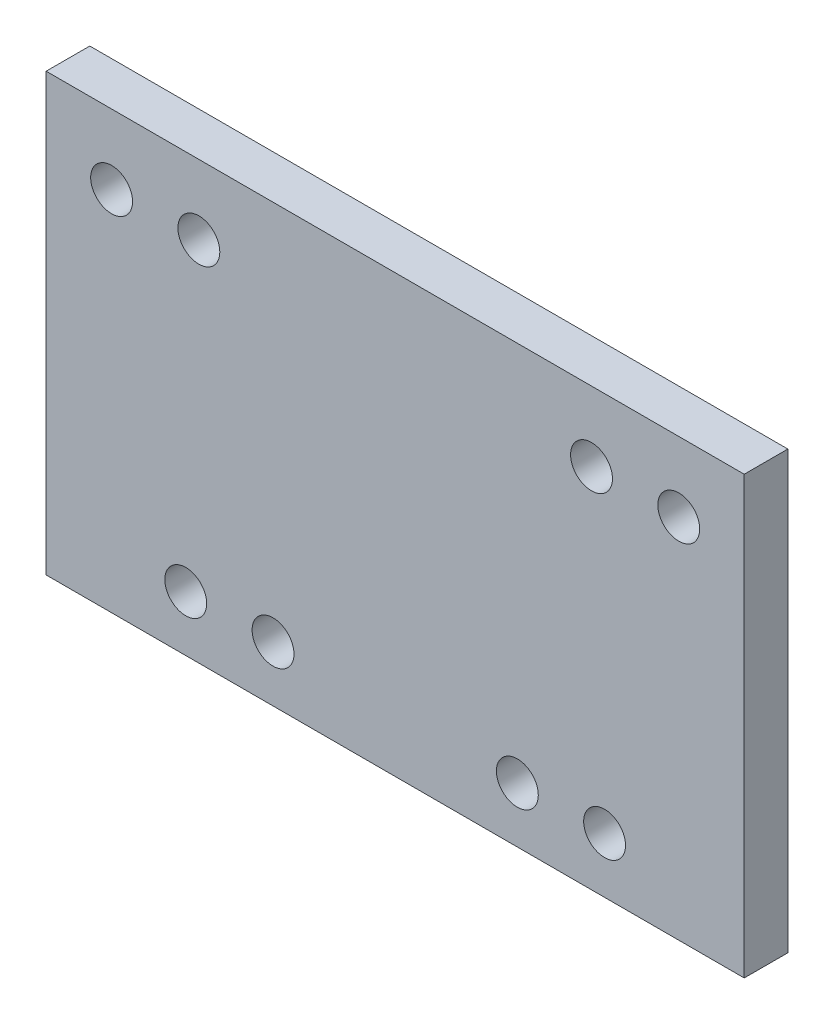
ISO-10303-21;
HEADER;
FILE_DESCRIPTION(('STEP AP214'),'2;1');
FILE_NAME('part.step','',(''),(''),'','','');
FILE_SCHEMA(('AUTOMOTIVE_DESIGN { 1 0 10303 214 1 1 1 1 }'));
ENDSEC;
DATA;
#1=APPLICATION_CONTEXT('core data for automotive mechanical design processes');
#2=APPLICATION_PROTOCOL_DEFINITION('international standard','automotive_design',2000,#1);
#3=PRODUCT_CONTEXT('',#1,'mechanical');
#4=PRODUCT('Part','Part','',(#3));
#5=PRODUCT_RELATED_PRODUCT_CATEGORY('part','',(#4));
#6=PRODUCT_DEFINITION_FORMATION('','',#4);
#7=PRODUCT_DEFINITION_CONTEXT('part definition',#1,'design');
#8=PRODUCT_DEFINITION('design','',#6,#7);
#9=PRODUCT_DEFINITION_SHAPE('','',#8);
#10=(LENGTH_UNIT() NAMED_UNIT(*) SI_UNIT(.MILLI.,.METRE.));
#11=(NAMED_UNIT(*) PLANE_ANGLE_UNIT() SI_UNIT($,.RADIAN.));
#12=(NAMED_UNIT(*) SI_UNIT($,.STERADIAN.) SOLID_ANGLE_UNIT());
#13=UNCERTAINTY_MEASURE_WITH_UNIT(LENGTH_MEASURE(1.E-05),#10,'distance_accuracy_value','');
#14=(GEOMETRIC_REPRESENTATION_CONTEXT(3) GLOBAL_UNCERTAINTY_ASSIGNED_CONTEXT((#13)) GLOBAL_UNIT_ASSIGNED_CONTEXT((#10,
#11,#12)) REPRESENTATION_CONTEXT('',''));
#15=CARTESIAN_POINT('',(0.,0.,0.));
#16=DIRECTION('',(0.,0.,1.));
#17=DIRECTION('',(1.,0.,0.));
#18=AXIS2_PLACEMENT_3D('',#15,#16,#17);
#19=CARTESIAN_POINT('',(39.9999999999999,24.9999999999999,5.));
#20=DIRECTION('',(-1.,0.,0.));
#21=DIRECTION('',(0.,0.,1.));
#22=AXIS2_PLACEMENT_3D('',#19,#20,#21);
#23=PLANE('',#22);
#24=DIRECTION('',(0.,1.,0.));
#25=VECTOR('',#24,1.);
#26=CARTESIAN_POINT('',(39.9999999999999,24.9999999999999,0.));
#27=LINE('',#26,#25);
#28=CARTESIAN_POINT('',(39.9999999999999,-25.0000000000001,0.));
#29=VERTEX_POINT('',#28);
#30=CARTESIAN_POINT('',(39.9999999999999,24.9999999999999,0.));
#31=VERTEX_POINT('',#30);
#32=EDGE_CURVE('E100',#29,#31,#27,.T.);
#33=ORIENTED_EDGE('',*,*,#32,.T.);
#34=DIRECTION('',(0.,0.,-1.));
#35=VECTOR('',#34,1.);
#36=CARTESIAN_POINT('',(39.9999999999999,24.9999999999999,5.));
#37=LINE('',#36,#35);
#38=CARTESIAN_POINT('',(39.9999999999999,24.9999999999999,5.));
#39=VERTEX_POINT('',#38);
#40=EDGE_CURVE('E11',#39,#31,#37,.T.);
#41=ORIENTED_EDGE('',*,*,#40,.F.);
#42=DIRECTION('',(0.,1.,0.));
#43=VECTOR('',#42,1.);
#44=CARTESIAN_POINT('',(39.9999999999999,24.9999999999999,5.));
#45=LINE('',#44,#43);
#46=CARTESIAN_POINT('',(39.9999999999999,-25.0000000000001,5.));
#47=VERTEX_POINT('',#46);
#48=EDGE_CURVE('E88',#47,#39,#45,.T.);
#49=ORIENTED_EDGE('',*,*,#48,.F.);
#50=DIRECTION('',(0.,0.,-1.));
#51=VECTOR('',#50,1.);
#52=CARTESIAN_POINT('',(39.9999999999999,-25.0000000000001,5.));
#53=LINE('',#52,#51);
#54=EDGE_CURVE('E96',#47,#29,#53,.T.);
#55=ORIENTED_EDGE('',*,*,#54,.T.);
#56=EDGE_LOOP('',(#33,#41,#49,#55));
#57=FACE_BOUND('',#56,.T.);
#58=ADVANCED_FACE('F37',(#57),#23,.F.);
#59=CARTESIAN_POINT('',(-39.9999999999999,24.9999999999999,5.));
#60=DIRECTION('',(0.,-1.,0.));
#61=DIRECTION('',(0.,0.,-1.));
#62=AXIS2_PLACEMENT_3D('',#59,#60,#61);
#63=PLANE('',#62);
#64=DIRECTION('',(-1.,0.,0.));
#65=VECTOR('',#64,1.);
#66=CARTESIAN_POINT('',(-39.9999999999999,24.9999999999999,0.));
#67=LINE('',#66,#65);
#68=CARTESIAN_POINT('',(-39.9999999999999,24.9999999999999,0.));
#69=VERTEX_POINT('',#68);
#70=EDGE_CURVE('E92',#31,#69,#67,.T.);
#71=ORIENTED_EDGE('',*,*,#70,.T.);
#72=DIRECTION('',(0.,0.,-1.));
#73=VECTOR('',#72,1.);
#74=CARTESIAN_POINT('',(-39.9999999999999,24.9999999999999,5.));
#75=LINE('',#74,#73);
#76=CARTESIAN_POINT('',(-39.9999999999999,24.9999999999999,5.));
#77=VERTEX_POINT('',#76);
#78=EDGE_CURVE('E45',#77,#69,#75,.T.);
#79=ORIENTED_EDGE('',*,*,#78,.F.);
#80=DIRECTION('',(-1.,0.,0.));
#81=VECTOR('',#80,1.);
#82=CARTESIAN_POINT('',(-39.9999999999999,24.9999999999999,5.));
#83=LINE('',#82,#81);
#84=EDGE_CURVE('E83',#39,#77,#83,.T.);
#85=ORIENTED_EDGE('',*,*,#84,.F.);
#86=ORIENTED_EDGE('',*,*,#40,.T.);
#87=EDGE_LOOP('',(#71,#79,#85,#86));
#88=FACE_BOUND('',#87,.T.);
#89=ADVANCED_FACE('F91',(#88),#63,.F.);
#90=CARTESIAN_POINT('',(-39.9999999999999,24.9999999999999,5.));
#91=DIRECTION('',(1.,0.,0.));
#92=DIRECTION('',(0.,0.,-1.));
#93=AXIS2_PLACEMENT_3D('',#90,#91,#92);
#94=PLANE('',#93);
#95=DIRECTION('',(0.,-1.,0.));
#96=VECTOR('',#95,1.);
#97=CARTESIAN_POINT('',(-39.9999999999999,24.9999999999999,0.));
#98=LINE('',#97,#96);
#99=CARTESIAN_POINT('',(-39.9999999999999,-25.0000000000001,0.));
#100=VERTEX_POINT('',#99);
#101=EDGE_CURVE('E70',#69,#100,#98,.T.);
#102=ORIENTED_EDGE('',*,*,#101,.T.);
#103=DIRECTION('',(0.,0.,-1.));
#104=VECTOR('',#103,1.);
#105=CARTESIAN_POINT('',(-39.9999999999999,-25.0000000000001,5.));
#106=LINE('',#105,#104);
#107=CARTESIAN_POINT('',(-39.9999999999999,-25.0000000000001,5.));
#108=VERTEX_POINT('',#107);
#109=EDGE_CURVE('E93',#108,#100,#106,.T.);
#110=ORIENTED_EDGE('',*,*,#109,.F.);
#111=DIRECTION('',(0.,-1.,0.));
#112=VECTOR('',#111,1.);
#113=CARTESIAN_POINT('',(-39.9999999999999,24.9999999999999,5.));
#114=LINE('',#113,#112);
#115=EDGE_CURVE('E86',#77,#108,#114,.T.);
#116=ORIENTED_EDGE('',*,*,#115,.F.);
#117=ORIENTED_EDGE('',*,*,#78,.T.);
#118=EDGE_LOOP('',(#102,#110,#116,#117));
#119=FACE_BOUND('',#118,.T.);
#120=ADVANCED_FACE('F94',(#119),#94,.F.);
#121=CARTESIAN_POINT('',(-39.9999999999999,-25.0000000000001,5.));
#122=DIRECTION('',(0.,1.,0.));
#123=DIRECTION('',(0.,0.,1.));
#124=AXIS2_PLACEMENT_3D('',#121,#122,#123);
#125=PLANE('',#124);
#126=DIRECTION('',(1.,0.,0.));
#127=VECTOR('',#126,1.);
#128=CARTESIAN_POINT('',(-39.9999999999999,-25.0000000000001,0.));
#129=LINE('',#128,#127);
#130=EDGE_CURVE('E76',#100,#29,#129,.T.);
#131=ORIENTED_EDGE('',*,*,#130,.T.);
#132=ORIENTED_EDGE('',*,*,#54,.F.);
#133=DIRECTION('',(1.,0.,0.));
#134=VECTOR('',#133,1.);
#135=CARTESIAN_POINT('',(-39.9999999999999,-25.0000000000001,5.));
#136=LINE('',#135,#134);
#137=EDGE_CURVE('E53',#108,#47,#136,.T.);
#138=ORIENTED_EDGE('',*,*,#137,.F.);
#139=ORIENTED_EDGE('',*,*,#109,.T.);
#140=EDGE_LOOP('',(#131,#132,#138,#139));
#141=FACE_BOUND('',#140,.T.);
#142=ADVANCED_FACE('F108',(#141),#125,.F.);
#143=CARTESIAN_POINT('',(0.,0.,5.));
#144=DIRECTION('',(0.,0.,1.));
#145=DIRECTION('',(1.,0.,0.));
#146=AXIS2_PLACEMENT_3D('',#143,#144,#145);
#147=PLANE('',#146);
#148=CARTESIAN_POINT('',(-32.4999999999999,17.0000000999999,5.));
#149=DIRECTION('',(0.,0.,1.));
#150=DIRECTION('',(1.,0.,0.));
#151=AXIS2_PLACEMENT_3D('',#148,#149,#150);
#152=CIRCLE('',#151,2.39999999999999);
#153=CARTESIAN_POINT('',(-30.1,17.0000000999999,5.));
#154=VERTEX_POINT('',#153);
#155=EDGE_CURVE('E158',#154,#154,#152,.T.);
#156=ORIENTED_EDGE('',*,*,#155,.F.);
#157=EDGE_LOOP('',(#156));
#158=FACE_BOUND('',#157,.T.);
#159=CARTESIAN_POINT('',(-22.4999999999999,17.0000001,5.));
#160=DIRECTION('',(0.,0.,1.));
#161=DIRECTION('',(1.,0.,0.));
#162=AXIS2_PLACEMENT_3D('',#159,#160,#161);
#163=CIRCLE('',#162,2.39999999999999);
#164=CARTESIAN_POINT('',(-20.1,17.0000001,5.));
#165=VERTEX_POINT('',#164);
#166=EDGE_CURVE('E152',#165,#165,#163,.T.);
#167=ORIENTED_EDGE('',*,*,#166,.F.);
#168=EDGE_LOOP('',(#167));
#169=FACE_BOUND('',#168,.T.);
#170=CARTESIAN_POINT('',(-23.9999999999996,-18.6499999999999,5.));
#171=DIRECTION('',(0.,0.,1.));
#172=DIRECTION('',(1.,0.,0.));
#173=AXIS2_PLACEMENT_3D('',#170,#171,#172);
#174=CIRCLE('',#173,2.39999999999999);
#175=CARTESIAN_POINT('',(-21.5999999999996,-18.6499999999999,5.));
#176=VERTEX_POINT('',#175);
#177=EDGE_CURVE('E146',#176,#176,#174,.T.);
#178=ORIENTED_EDGE('',*,*,#177,.F.);
#179=EDGE_LOOP('',(#178));
#180=FACE_BOUND('',#179,.T.);
#181=CARTESIAN_POINT('',(-13.9999999999996,-18.6499999999999,5.));
#182=DIRECTION('',(0.,0.,1.));
#183=DIRECTION('',(1.,0.,0.));
#184=AXIS2_PLACEMENT_3D('',#181,#182,#183);
#185=CIRCLE('',#184,2.39999999999999);
#186=CARTESIAN_POINT('',(-11.5999999999996,-18.6499999999999,5.));
#187=VERTEX_POINT('',#186);
#188=EDGE_CURVE('E140',#187,#187,#185,.T.);
#189=ORIENTED_EDGE('',*,*,#188,.F.);
#190=EDGE_LOOP('',(#189));
#191=FACE_BOUND('',#190,.T.);
#192=CARTESIAN_POINT('',(13.9999999999996,-18.6499999999999,5.));
#193=DIRECTION('',(0.,0.,1.));
#194=DIRECTION('',(1.,0.,0.));
#195=AXIS2_PLACEMENT_3D('',#192,#193,#194);
#196=CIRCLE('',#195,2.39999999999999);
#197=CARTESIAN_POINT('',(16.3999999999996,-18.6499999999999,5.));
#198=VERTEX_POINT('',#197);
#199=EDGE_CURVE('E134',#198,#198,#196,.T.);
#200=ORIENTED_EDGE('',*,*,#199,.F.);
#201=EDGE_LOOP('',(#200));
#202=FACE_BOUND('',#201,.T.);
#203=CARTESIAN_POINT('',(23.9999999999996,-18.6499999999999,5.));
#204=DIRECTION('',(0.,0.,1.));
#205=DIRECTION('',(1.,0.,0.));
#206=AXIS2_PLACEMENT_3D('',#203,#204,#205);
#207=CIRCLE('',#206,2.39999999999999);
#208=CARTESIAN_POINT('',(26.3999999999996,-18.6499999999999,5.));
#209=VERTEX_POINT('',#208);
#210=EDGE_CURVE('E128',#209,#209,#207,.T.);
#211=ORIENTED_EDGE('',*,*,#210,.F.);
#212=EDGE_LOOP('',(#211));
#213=FACE_BOUND('',#212,.T.);
#214=CARTESIAN_POINT('',(22.4999999999999,17.0000001,5.));
#215=DIRECTION('',(0.,0.,1.));
#216=DIRECTION('',(1.,0.,0.));
#217=AXIS2_PLACEMENT_3D('',#214,#215,#216);
#218=CIRCLE('',#217,2.39999999999999);
#219=CARTESIAN_POINT('',(24.8999999999999,17.0000001,5.));
#220=VERTEX_POINT('',#219);
#221=EDGE_CURVE('E122',#220,#220,#218,.T.);
#222=ORIENTED_EDGE('',*,*,#221,.F.);
#223=EDGE_LOOP('',(#222));
#224=FACE_BOUND('',#223,.T.);
#225=CARTESIAN_POINT('',(32.4999999999999,17.0000000999999,5.));
#226=DIRECTION('',(0.,0.,1.));
#227=DIRECTION('',(1.,0.,0.));
#228=AXIS2_PLACEMENT_3D('',#225,#226,#227);
#229=CIRCLE('',#228,2.39999999999999);
#230=CARTESIAN_POINT('',(34.8999999999999,17.0000000999999,5.));
#231=VERTEX_POINT('',#230);
#232=EDGE_CURVE('E116',#231,#231,#229,.T.);
#233=ORIENTED_EDGE('',*,*,#232,.F.);
#234=EDGE_LOOP('',(#233));
#235=FACE_BOUND('',#234,.T.);
#236=ORIENTED_EDGE('',*,*,#48,.T.);
#237=ORIENTED_EDGE('',*,*,#84,.T.);
#238=ORIENTED_EDGE('',*,*,#115,.T.);
#239=ORIENTED_EDGE('',*,*,#137,.T.);
#240=EDGE_LOOP('',(#236,#237,#238,#239));
#241=FACE_BOUND('',#240,.T.);
#242=ADVANCED_FACE('F84',(#158,#169,#180,#191,#202,#213,#224,#235,#241),#147,.T.);
#243=CARTESIAN_POINT('',(0.,0.,0.));
#244=DIRECTION('',(0.,0.,1.));
#245=DIRECTION('',(1.,0.,0.));
#246=AXIS2_PLACEMENT_3D('',#243,#244,#245);
#247=PLANE('',#246);
#248=CARTESIAN_POINT('',(-32.4999999999999,17.0000000999999,0.));
#249=DIRECTION('',(0.,0.,1.));
#250=DIRECTION('',(1.,0.,0.));
#251=AXIS2_PLACEMENT_3D('',#248,#249,#250);
#252=CIRCLE('',#251,2.4);
#253=CARTESIAN_POINT('',(-30.0999999999999,17.0000000999999,0.));
#254=VERTEX_POINT('',#253);
#255=EDGE_CURVE('E155',#254,#254,#252,.T.);
#256=ORIENTED_EDGE('',*,*,#255,.T.);
#257=EDGE_LOOP('',(#256));
#258=FACE_BOUND('',#257,.T.);
#259=CARTESIAN_POINT('',(-22.4999999999999,17.0000001,0.));
#260=DIRECTION('',(0.,0.,1.));
#261=DIRECTION('',(1.,0.,0.));
#262=AXIS2_PLACEMENT_3D('',#259,#260,#261);
#263=CIRCLE('',#262,2.4);
#264=CARTESIAN_POINT('',(-20.0999999999999,17.0000001,0.));
#265=VERTEX_POINT('',#264);
#266=EDGE_CURVE('E149',#265,#265,#263,.T.);
#267=ORIENTED_EDGE('',*,*,#266,.T.);
#268=EDGE_LOOP('',(#267));
#269=FACE_BOUND('',#268,.T.);
#270=CARTESIAN_POINT('',(-23.9999999999996,-18.6499999999999,0.));
#271=DIRECTION('',(0.,0.,1.));
#272=DIRECTION('',(1.,0.,0.));
#273=AXIS2_PLACEMENT_3D('',#270,#271,#272);
#274=CIRCLE('',#273,2.4);
#275=CARTESIAN_POINT('',(-21.5999999999996,-18.6499999999999,0.));
#276=VERTEX_POINT('',#275);
#277=EDGE_CURVE('E143',#276,#276,#274,.T.);
#278=ORIENTED_EDGE('',*,*,#277,.T.);
#279=EDGE_LOOP('',(#278));
#280=FACE_BOUND('',#279,.T.);
#281=CARTESIAN_POINT('',(-13.9999999999996,-18.6499999999999,0.));
#282=DIRECTION('',(0.,0.,1.));
#283=DIRECTION('',(1.,0.,0.));
#284=AXIS2_PLACEMENT_3D('',#281,#282,#283);
#285=CIRCLE('',#284,2.4);
#286=CARTESIAN_POINT('',(-11.5999999999996,-18.6499999999999,0.));
#287=VERTEX_POINT('',#286);
#288=EDGE_CURVE('E137',#287,#287,#285,.T.);
#289=ORIENTED_EDGE('',*,*,#288,.T.);
#290=EDGE_LOOP('',(#289));
#291=FACE_BOUND('',#290,.T.);
#292=CARTESIAN_POINT('',(13.9999999999996,-18.6499999999999,0.));
#293=DIRECTION('',(0.,0.,1.));
#294=DIRECTION('',(1.,0.,0.));
#295=AXIS2_PLACEMENT_3D('',#292,#293,#294);
#296=CIRCLE('',#295,2.4);
#297=CARTESIAN_POINT('',(16.3999999999996,-18.6499999999999,0.));
#298=VERTEX_POINT('',#297);
#299=EDGE_CURVE('E131',#298,#298,#296,.T.);
#300=ORIENTED_EDGE('',*,*,#299,.T.);
#301=EDGE_LOOP('',(#300));
#302=FACE_BOUND('',#301,.T.);
#303=CARTESIAN_POINT('',(23.9999999999996,-18.6499999999999,0.));
#304=DIRECTION('',(0.,0.,1.));
#305=DIRECTION('',(1.,0.,0.));
#306=AXIS2_PLACEMENT_3D('',#303,#304,#305);
#307=CIRCLE('',#306,2.4);
#308=CARTESIAN_POINT('',(26.3999999999996,-18.6499999999999,0.));
#309=VERTEX_POINT('',#308);
#310=EDGE_CURVE('E125',#309,#309,#307,.T.);
#311=ORIENTED_EDGE('',*,*,#310,.T.);
#312=EDGE_LOOP('',(#311));
#313=FACE_BOUND('',#312,.T.);
#314=CARTESIAN_POINT('',(22.4999999999999,17.0000001,0.));
#315=DIRECTION('',(0.,0.,1.));
#316=DIRECTION('',(1.,0.,0.));
#317=AXIS2_PLACEMENT_3D('',#314,#315,#316);
#318=CIRCLE('',#317,2.4);
#319=CARTESIAN_POINT('',(24.8999999999999,17.0000001,0.));
#320=VERTEX_POINT('',#319);
#321=EDGE_CURVE('E119',#320,#320,#318,.T.);
#322=ORIENTED_EDGE('',*,*,#321,.T.);
#323=EDGE_LOOP('',(#322));
#324=FACE_BOUND('',#323,.T.);
#325=CARTESIAN_POINT('',(32.4999999999999,17.0000000999999,0.));
#326=DIRECTION('',(0.,0.,1.));
#327=DIRECTION('',(1.,0.,0.));
#328=AXIS2_PLACEMENT_3D('',#325,#326,#327);
#329=CIRCLE('',#328,2.4);
#330=CARTESIAN_POINT('',(34.8999999999999,17.0000000999999,0.));
#331=VERTEX_POINT('',#330);
#332=EDGE_CURVE('E103',#331,#331,#329,.T.);
#333=ORIENTED_EDGE('',*,*,#332,.T.);
#334=EDGE_LOOP('',(#333));
#335=FACE_BOUND('',#334,.T.);
#336=ORIENTED_EDGE('',*,*,#32,.F.);
#337=ORIENTED_EDGE('',*,*,#130,.F.);
#338=ORIENTED_EDGE('',*,*,#101,.F.);
#339=ORIENTED_EDGE('',*,*,#70,.F.);
#340=EDGE_LOOP('',(#336,#337,#338,#339));
#341=FACE_BOUND('',#340,.T.);
#342=ADVANCED_FACE('F111',(#258,#269,#280,#291,#302,#313,#324,#335,#341),#247,.F.);
#343=CARTESIAN_POINT('',(32.4999999999999,17.0000000999999,5.));
#344=DIRECTION('',(0.,0.,1.));
#345=DIRECTION('',(1.,0.,0.));
#346=AXIS2_PLACEMENT_3D('',#343,#344,#345);
#347=CYLINDRICAL_SURFACE('',#346,2.39999999999999);
#348=ORIENTED_EDGE('',*,*,#332,.F.);
#349=EDGE_LOOP('',(#348));
#350=FACE_BOUND('',#349,.T.);
#351=ORIENTED_EDGE('',*,*,#232,.T.);
#352=EDGE_LOOP('',(#351));
#353=FACE_BOUND('',#352,.T.);
#354=ADVANCED_FACE('F181',(#350,#353),#347,.F.);
#355=CARTESIAN_POINT('',(22.4999999999999,17.0000001,5.));
#356=DIRECTION('',(0.,0.,1.));
#357=DIRECTION('',(1.,0.,0.));
#358=AXIS2_PLACEMENT_3D('',#355,#356,#357);
#359=CYLINDRICAL_SURFACE('',#358,2.39999999999999);
#360=ORIENTED_EDGE('',*,*,#321,.F.);
#361=EDGE_LOOP('',(#360));
#362=FACE_BOUND('',#361,.T.);
#363=ORIENTED_EDGE('',*,*,#221,.T.);
#364=EDGE_LOOP('',(#363));
#365=FACE_BOUND('',#364,.T.);
#366=ADVANCED_FACE('F183',(#362,#365),#359,.F.);
#367=CARTESIAN_POINT('',(23.9999999999996,-18.6499999999999,5.));
#368=DIRECTION('',(0.,0.,1.));
#369=DIRECTION('',(1.,0.,0.));
#370=AXIS2_PLACEMENT_3D('',#367,#368,#369);
#371=CYLINDRICAL_SURFACE('',#370,2.39999999999999);
#372=ORIENTED_EDGE('',*,*,#310,.F.);
#373=EDGE_LOOP('',(#372));
#374=FACE_BOUND('',#373,.T.);
#375=ORIENTED_EDGE('',*,*,#210,.T.);
#376=EDGE_LOOP('',(#375));
#377=FACE_BOUND('',#376,.T.);
#378=ADVANCED_FACE('F190',(#374,#377),#371,.F.);
#379=CARTESIAN_POINT('',(13.9999999999996,-18.6499999999999,5.));
#380=DIRECTION('',(0.,0.,1.));
#381=DIRECTION('',(1.,0.,0.));
#382=AXIS2_PLACEMENT_3D('',#379,#380,#381);
#383=CYLINDRICAL_SURFACE('',#382,2.39999999999999);
#384=ORIENTED_EDGE('',*,*,#299,.F.);
#385=EDGE_LOOP('',(#384));
#386=FACE_BOUND('',#385,.T.);
#387=ORIENTED_EDGE('',*,*,#199,.T.);
#388=EDGE_LOOP('',(#387));
#389=FACE_BOUND('',#388,.T.);
#390=ADVANCED_FACE('F243',(#386,#389),#383,.F.);
#391=CARTESIAN_POINT('',(-13.9999999999996,-18.6499999999999,5.));
#392=DIRECTION('',(0.,0.,1.));
#393=DIRECTION('',(1.,0.,0.));
#394=AXIS2_PLACEMENT_3D('',#391,#392,#393);
#395=CYLINDRICAL_SURFACE('',#394,2.39999999999999);
#396=ORIENTED_EDGE('',*,*,#288,.F.);
#397=EDGE_LOOP('',(#396));
#398=FACE_BOUND('',#397,.T.);
#399=ORIENTED_EDGE('',*,*,#188,.T.);
#400=EDGE_LOOP('',(#399));
#401=FACE_BOUND('',#400,.T.);
#402=ADVANCED_FACE('F254',(#398,#401),#395,.F.);
#403=CARTESIAN_POINT('',(-23.9999999999996,-18.6499999999999,5.));
#404=DIRECTION('',(0.,0.,1.));
#405=DIRECTION('',(1.,0.,0.));
#406=AXIS2_PLACEMENT_3D('',#403,#404,#405);
#407=CYLINDRICAL_SURFACE('',#406,2.39999999999999);
#408=ORIENTED_EDGE('',*,*,#277,.F.);
#409=EDGE_LOOP('',(#408));
#410=FACE_BOUND('',#409,.T.);
#411=ORIENTED_EDGE('',*,*,#177,.T.);
#412=EDGE_LOOP('',(#411));
#413=FACE_BOUND('',#412,.T.);
#414=ADVANCED_FACE('F265',(#410,#413),#407,.F.);
#415=CARTESIAN_POINT('',(-22.4999999999999,17.0000001,5.));
#416=DIRECTION('',(0.,0.,1.));
#417=DIRECTION('',(1.,0.,0.));
#418=AXIS2_PLACEMENT_3D('',#415,#416,#417);
#419=CYLINDRICAL_SURFACE('',#418,2.39999999999999);
#420=ORIENTED_EDGE('',*,*,#266,.F.);
#421=EDGE_LOOP('',(#420));
#422=FACE_BOUND('',#421,.T.);
#423=ORIENTED_EDGE('',*,*,#166,.T.);
#424=EDGE_LOOP('',(#423));
#425=FACE_BOUND('',#424,.T.);
#426=ADVANCED_FACE('F276',(#422,#425),#419,.F.);
#427=CARTESIAN_POINT('',(-32.4999999999999,17.0000000999999,5.));
#428=DIRECTION('',(0.,0.,1.));
#429=DIRECTION('',(1.,0.,0.));
#430=AXIS2_PLACEMENT_3D('',#427,#428,#429);
#431=CYLINDRICAL_SURFACE('',#430,2.39999999999999);
#432=ORIENTED_EDGE('',*,*,#255,.F.);
#433=EDGE_LOOP('',(#432));
#434=FACE_BOUND('',#433,.T.);
#435=ORIENTED_EDGE('',*,*,#155,.T.);
#436=EDGE_LOOP('',(#435));
#437=FACE_BOUND('',#436,.T.);
#438=ADVANCED_FACE('F162',(#434,#437),#431,.F.);
#439=CLOSED_SHELL('',(#58,#89,#120,#142,#242,#342,#354,#366,#378,#390,#402,#414,#426,#438));
#440=MANIFOLD_SOLID_BREP('B2',#439);
#441=ADVANCED_BREP_SHAPE_REPRESENTATION('',(#18,#440),#14);
#442=SHAPE_DEFINITION_REPRESENTATION(#9,#441);
ENDSEC;
END-ISO-10303-21;
